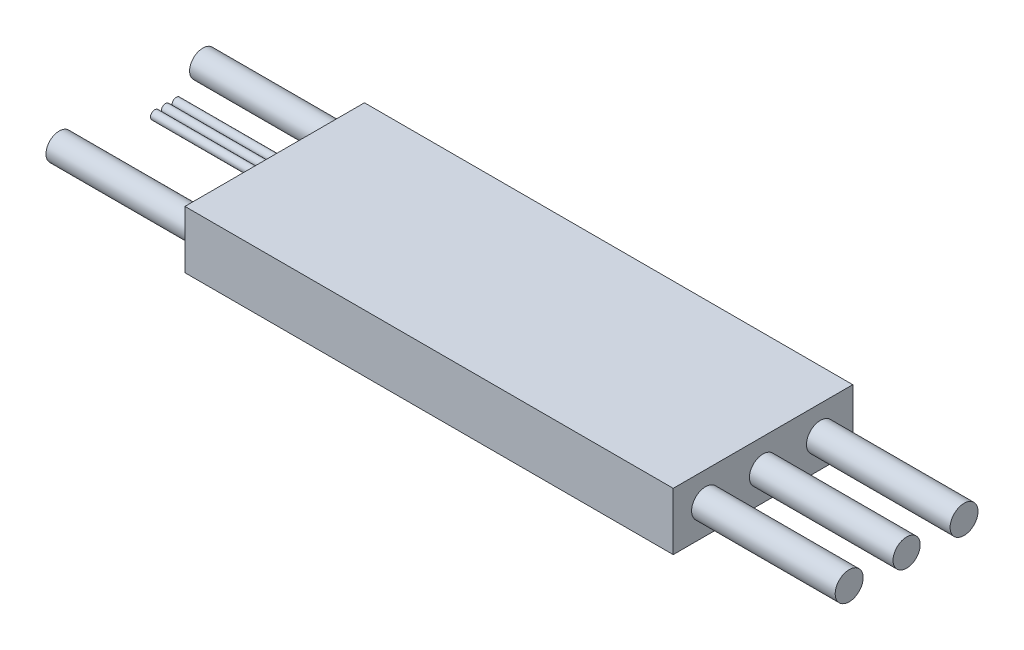
ISO-10303-21;
HEADER;
FILE_DESCRIPTION(('STEP AP214'),'2;1');
FILE_NAME('part.step','',(''),(''),'','','');
FILE_SCHEMA(('AUTOMOTIVE_DESIGN { 1 0 10303 214 1 1 1 1 }'));
ENDSEC;
DATA;
#1=APPLICATION_CONTEXT('core data for automotive mechanical design processes');
#2=APPLICATION_PROTOCOL_DEFINITION('international standard','automotive_design',2000,#1);
#3=PRODUCT_CONTEXT('',#1,'mechanical');
#4=PRODUCT('Part','Part','',(#3));
#5=PRODUCT_RELATED_PRODUCT_CATEGORY('part','',(#4));
#6=PRODUCT_DEFINITION_FORMATION('','',#4);
#7=PRODUCT_DEFINITION_CONTEXT('part definition',#1,'design');
#8=PRODUCT_DEFINITION('design','',#6,#7);
#9=PRODUCT_DEFINITION_SHAPE('','',#8);
#10=(LENGTH_UNIT() NAMED_UNIT(*) SI_UNIT(.MILLI.,.METRE.));
#11=(NAMED_UNIT(*) PLANE_ANGLE_UNIT() SI_UNIT($,.RADIAN.));
#12=(NAMED_UNIT(*) SI_UNIT($,.STERADIAN.) SOLID_ANGLE_UNIT());
#13=UNCERTAINTY_MEASURE_WITH_UNIT(LENGTH_MEASURE(1.E-05),#10,'distance_accuracy_value','');
#14=(GEOMETRIC_REPRESENTATION_CONTEXT(3) GLOBAL_UNCERTAINTY_ASSIGNED_CONTEXT((#13)) GLOBAL_UNIT_ASSIGNED_CONTEXT((#10,
#11,#12)) REPRESENTATION_CONTEXT('',''));
#15=CARTESIAN_POINT('',(0.,0.,0.));
#16=DIRECTION('',(0.,0.,1.));
#17=DIRECTION('',(1.,0.,0.));
#18=AXIS2_PLACEMENT_3D('',#15,#16,#17);
#19=CARTESIAN_POINT('',(-34.,8.,-12.5));
#20=DIRECTION('',(1.,0.,0.));
#21=DIRECTION('',(0.,0.,-1.));
#22=AXIS2_PLACEMENT_3D('',#19,#20,#21);
#23=PLANE('',#22);
#24=CARTESIAN_POINT('',(-34.,1.16252330107337,-3.30252833955041));
#25=DIRECTION('',(1.,0.,0.));
#26=DIRECTION('',(0.,0.,-1.));
#27=AXIS2_PLACEMENT_3D('',#24,#25,#26);
#28=CIRCLE('',#27,0.6);
#29=CARTESIAN_POINT('',(-34.,1.16252330107337,-3.90252833955041));
#30=VERTEX_POINT('',#29);
#31=EDGE_CURVE('E123',#30,#30,#28,.F.);
#32=ORIENTED_EDGE('',*,*,#31,.F.);
#33=EDGE_LOOP('',(#32));
#34=FACE_BOUND('',#33,.T.);
#35=CARTESIAN_POINT('',(-34.,1.16252330107337,-4.80252833955041));
#36=DIRECTION('',(1.,0.,0.));
#37=DIRECTION('',(0.,0.,-1.));
#38=AXIS2_PLACEMENT_3D('',#35,#36,#37);
#39=CIRCLE('',#38,0.6);
#40=CARTESIAN_POINT('',(-34.,1.16252330107337,-5.40252833955041));
#41=VERTEX_POINT('',#40);
#42=EDGE_CURVE('E120',#41,#41,#39,.F.);
#43=ORIENTED_EDGE('',*,*,#42,.F.);
#44=EDGE_LOOP('',(#43));
#45=FACE_BOUND('',#44,.T.);
#46=CARTESIAN_POINT('',(-34.,1.16252330107337,-6.30252833955041));
#47=DIRECTION('',(1.,0.,0.));
#48=DIRECTION('',(0.,0.,-1.));
#49=AXIS2_PLACEMENT_3D('',#46,#47,#48);
#50=CIRCLE('',#49,0.6);
#51=CARTESIAN_POINT('',(-34.,1.16252330107337,-6.90252833955041));
#52=VERTEX_POINT('',#51);
#53=EDGE_CURVE('E117',#52,#52,#50,.F.);
#54=ORIENTED_EDGE('',*,*,#53,.F.);
#55=EDGE_LOOP('',(#54));
#56=FACE_BOUND('',#55,.T.);
#57=CARTESIAN_POINT('',(-34.,4.,10.));
#58=DIRECTION('',(1.,0.,0.));
#59=DIRECTION('',(0.,0.,-1.));
#60=AXIS2_PLACEMENT_3D('',#57,#58,#59);
#61=CIRCLE('',#60,1.85);
#62=CARTESIAN_POINT('',(-34.,4.,8.15));
#63=VERTEX_POINT('',#62);
#64=EDGE_CURVE('E114',#63,#63,#61,.F.);
#65=ORIENTED_EDGE('',*,*,#64,.F.);
#66=EDGE_LOOP('',(#65));
#67=FACE_BOUND('',#66,.T.);
#68=CARTESIAN_POINT('',(-34.,4.,-10.));
#69=DIRECTION('',(1.,0.,0.));
#70=DIRECTION('',(0.,0.,-1.));
#71=AXIS2_PLACEMENT_3D('',#68,#69,#70);
#72=CIRCLE('',#71,1.85);
#73=CARTESIAN_POINT('',(-34.,4.,-11.85));
#74=VERTEX_POINT('',#73);
#75=EDGE_CURVE('E111',#74,#74,#72,.F.);
#76=ORIENTED_EDGE('',*,*,#75,.F.);
#77=EDGE_LOOP('',(#76));
#78=FACE_BOUND('',#77,.T.);
#79=DIRECTION('',(0.,0.,1.));
#80=VECTOR('',#79,1.);
#81=CARTESIAN_POINT('',(-34.,0.,-12.5));
#82=LINE('',#81,#80);
#83=CARTESIAN_POINT('',(-34.,0.,-12.5));
#84=VERTEX_POINT('',#83);
#85=CARTESIAN_POINT('',(-34.,0.,12.5));
#86=VERTEX_POINT('',#85);
#87=EDGE_CURVE('E101',#84,#86,#82,.T.);
#88=ORIENTED_EDGE('',*,*,#87,.T.);
#89=DIRECTION('',(0.,-1.,0.));
#90=VECTOR('',#89,1.);
#91=CARTESIAN_POINT('',(-34.,8.,12.5));
#92=LINE('',#91,#90);
#93=CARTESIAN_POINT('',(-34.,8.,12.5));
#94=VERTEX_POINT('',#93);
#95=EDGE_CURVE('E92',#94,#86,#92,.T.);
#96=ORIENTED_EDGE('',*,*,#95,.F.);
#97=DIRECTION('',(0.,0.,1.));
#98=VECTOR('',#97,1.);
#99=CARTESIAN_POINT('',(-34.,8.,-12.5));
#100=LINE('',#99,#98);
#101=CARTESIAN_POINT('',(-34.,8.,-12.5));
#102=VERTEX_POINT('',#101);
#103=EDGE_CURVE('E86',#102,#94,#100,.T.);
#104=ORIENTED_EDGE('',*,*,#103,.F.);
#105=DIRECTION('',(0.,-1.,0.));
#106=VECTOR('',#105,1.);
#107=CARTESIAN_POINT('',(-34.,8.,-12.5));
#108=LINE('',#107,#106);
#109=EDGE_CURVE('E97',#102,#84,#108,.T.);
#110=ORIENTED_EDGE('',*,*,#109,.T.);
#111=EDGE_LOOP('',(#88,#96,#104,#110));
#112=FACE_BOUND('',#111,.T.);
#113=ADVANCED_FACE('F34',(#34,#45,#56,#67,#78,#112),#23,.F.);
#114=CARTESIAN_POINT('',(-34.,8.,12.5));
#115=DIRECTION('',(0.,0.,-1.));
#116=DIRECTION('',(-1.,0.,0.));
#117=AXIS2_PLACEMENT_3D('',#114,#115,#116);
#118=PLANE('',#117);
#119=DIRECTION('',(1.,0.,0.));
#120=VECTOR('',#119,1.);
#121=CARTESIAN_POINT('',(-34.,0.,12.5));
#122=LINE('',#121,#120);
#123=CARTESIAN_POINT('',(34.,0.,12.5));
#124=VERTEX_POINT('',#123);
#125=EDGE_CURVE('E91',#86,#124,#122,.T.);
#126=ORIENTED_EDGE('',*,*,#125,.T.);
#127=DIRECTION('',(0.,-1.,0.));
#128=VECTOR('',#127,1.);
#129=CARTESIAN_POINT('',(34.,8.,12.5));
#130=LINE('',#129,#128);
#131=CARTESIAN_POINT('',(34.,8.,12.5));
#132=VERTEX_POINT('',#131);
#133=EDGE_CURVE('E89',#132,#124,#130,.T.);
#134=ORIENTED_EDGE('',*,*,#133,.F.);
#135=DIRECTION('',(1.,0.,0.));
#136=VECTOR('',#135,1.);
#137=CARTESIAN_POINT('',(-34.,8.,12.5));
#138=LINE('',#137,#136);
#139=EDGE_CURVE('E81',#94,#132,#138,.T.);
#140=ORIENTED_EDGE('',*,*,#139,.F.);
#141=ORIENTED_EDGE('',*,*,#95,.T.);
#142=EDGE_LOOP('',(#126,#134,#140,#141));
#143=FACE_BOUND('',#142,.T.);
#144=ADVANCED_FACE('F90',(#143),#118,.F.);
#145=CARTESIAN_POINT('',(34.,8.,-12.5));
#146=DIRECTION('',(-1.,0.,0.));
#147=DIRECTION('',(0.,0.,1.));
#148=AXIS2_PLACEMENT_3D('',#145,#146,#147);
#149=PLANE('',#148);
#150=CARTESIAN_POINT('',(34.,4.,-8.));
#151=DIRECTION('',(-1.,0.,0.));
#152=DIRECTION('',(0.,0.,1.));
#153=AXIS2_PLACEMENT_3D('',#150,#151,#152);
#154=CIRCLE('',#153,1.94570262627597);
#155=CARTESIAN_POINT('',(34.,4.,-6.05429737372403));
#156=VERTEX_POINT('',#155);
#157=EDGE_CURVE('E11',#156,#156,#154,.F.);
#158=ORIENTED_EDGE('',*,*,#157,.F.);
#159=EDGE_LOOP('',(#158));
#160=FACE_BOUND('',#159,.T.);
#161=CARTESIAN_POINT('',(34.,4.,0.));
#162=DIRECTION('',(-1.,0.,0.));
#163=DIRECTION('',(0.,0.,1.));
#164=AXIS2_PLACEMENT_3D('',#161,#162,#163);
#165=CIRCLE('',#164,1.89143712586387);
#166=CARTESIAN_POINT('',(34.,4.,1.89143712586387));
#167=VERTEX_POINT('',#166);
#168=EDGE_CURVE('E42',#167,#167,#165,.F.);
#169=ORIENTED_EDGE('',*,*,#168,.F.);
#170=EDGE_LOOP('',(#169));
#171=FACE_BOUND('',#170,.T.);
#172=CARTESIAN_POINT('',(34.,4.,8.));
#173=DIRECTION('',(-1.,0.,0.));
#174=DIRECTION('',(0.,0.,1.));
#175=AXIS2_PLACEMENT_3D('',#172,#173,#174);
#176=CIRCLE('',#175,1.94570262627597);
#177=CARTESIAN_POINT('',(34.,4.,9.94570262627597));
#178=VERTEX_POINT('',#177);
#179=EDGE_CURVE('E126',#178,#178,#176,.F.);
#180=ORIENTED_EDGE('',*,*,#179,.F.);
#181=EDGE_LOOP('',(#180));
#182=FACE_BOUND('',#181,.T.);
#183=DIRECTION('',(0.,0.,-1.));
#184=VECTOR('',#183,1.);
#185=CARTESIAN_POINT('',(34.,0.,-12.5));
#186=LINE('',#185,#184);
#187=CARTESIAN_POINT('',(34.,0.,-12.5));
#188=VERTEX_POINT('',#187);
#189=EDGE_CURVE('E67',#124,#188,#186,.T.);
#190=ORIENTED_EDGE('',*,*,#189,.T.);
#191=DIRECTION('',(0.,-1.,0.));
#192=VECTOR('',#191,1.);
#193=CARTESIAN_POINT('',(34.,8.,-12.5));
#194=LINE('',#193,#192);
#195=CARTESIAN_POINT('',(34.,8.,-12.5));
#196=VERTEX_POINT('',#195);
#197=EDGE_CURVE('E93',#196,#188,#194,.T.);
#198=ORIENTED_EDGE('',*,*,#197,.F.);
#199=DIRECTION('',(0.,0.,-1.));
#200=VECTOR('',#199,1.);
#201=CARTESIAN_POINT('',(34.,8.,-12.5));
#202=LINE('',#201,#200);
#203=EDGE_CURVE('E84',#132,#196,#202,.T.);
#204=ORIENTED_EDGE('',*,*,#203,.F.);
#205=ORIENTED_EDGE('',*,*,#133,.T.);
#206=EDGE_LOOP('',(#190,#198,#204,#205));
#207=FACE_BOUND('',#206,.T.);
#208=ADVANCED_FACE('F95',(#160,#171,#182,#207),#149,.F.);
#209=CARTESIAN_POINT('',(-34.,8.,-12.5));
#210=DIRECTION('',(0.,0.,1.));
#211=DIRECTION('',(1.,0.,0.));
#212=AXIS2_PLACEMENT_3D('',#209,#210,#211);
#213=PLANE('',#212);
#214=DIRECTION('',(-1.,0.,0.));
#215=VECTOR('',#214,1.);
#216=CARTESIAN_POINT('',(-34.,0.,-12.5));
#217=LINE('',#216,#215);
#218=EDGE_CURVE('E73',#188,#84,#217,.T.);
#219=ORIENTED_EDGE('',*,*,#218,.T.);
#220=ORIENTED_EDGE('',*,*,#109,.F.);
#221=DIRECTION('',(-1.,0.,0.));
#222=VECTOR('',#221,1.);
#223=CARTESIAN_POINT('',(-34.,8.,-12.5));
#224=LINE('',#223,#222);
#225=EDGE_CURVE('E50',#196,#102,#224,.T.);
#226=ORIENTED_EDGE('',*,*,#225,.F.);
#227=ORIENTED_EDGE('',*,*,#197,.T.);
#228=EDGE_LOOP('',(#219,#220,#226,#227));
#229=FACE_BOUND('',#228,.T.);
#230=ADVANCED_FACE('F135',(#229),#213,.F.);
#231=CARTESIAN_POINT('',(0.,8.,0.));
#232=DIRECTION('',(0.,1.,0.));
#233=DIRECTION('',(0.,0.,1.));
#234=AXIS2_PLACEMENT_3D('',#231,#232,#233);
#235=PLANE('',#234);
#236=ORIENTED_EDGE('',*,*,#103,.T.);
#237=ORIENTED_EDGE('',*,*,#139,.T.);
#238=ORIENTED_EDGE('',*,*,#203,.T.);
#239=ORIENTED_EDGE('',*,*,#225,.T.);
#240=EDGE_LOOP('',(#236,#237,#238,#239));
#241=FACE_BOUND('',#240,.T.);
#242=ADVANCED_FACE('F82',(#241),#235,.T.);
#243=CARTESIAN_POINT('',(0.,0.,0.));
#244=DIRECTION('',(0.,1.,0.));
#245=DIRECTION('',(0.,0.,1.));
#246=AXIS2_PLACEMENT_3D('',#243,#244,#245);
#247=PLANE('',#246);
#248=ORIENTED_EDGE('',*,*,#87,.F.);
#249=ORIENTED_EDGE('',*,*,#218,.F.);
#250=ORIENTED_EDGE('',*,*,#189,.F.);
#251=ORIENTED_EDGE('',*,*,#125,.F.);
#252=EDGE_LOOP('',(#248,#249,#250,#251));
#253=FACE_BOUND('',#252,.T.);
#254=ADVANCED_FACE('F173',(#253),#247,.F.);
#255=CARTESIAN_POINT('',(-54.,4.,-10.));
#256=DIRECTION('',(1.,0.,0.));
#257=DIRECTION('',(0.,0.,-1.));
#258=AXIS2_PLACEMENT_3D('',#255,#256,#257);
#259=CYLINDRICAL_SURFACE('',#258,1.85);
#260=CARTESIAN_POINT('',(-54.,4.,-10.));
#261=DIRECTION('',(-1.,0.,0.));
#262=DIRECTION('',(0.,0.,1.));
#263=AXIS2_PLACEMENT_3D('',#260,#261,#262);
#264=CIRCLE('',#263,1.85);
#265=CARTESIAN_POINT('',(-54.,4.,-8.15));
#266=VERTEX_POINT('',#265);
#267=EDGE_CURVE('E104',#266,#266,#264,.T.);
#268=ORIENTED_EDGE('',*,*,#267,.F.);
#269=EDGE_LOOP('',(#268));
#270=FACE_BOUND('',#269,.T.);
#271=ORIENTED_EDGE('',*,*,#75,.T.);
#272=EDGE_LOOP('',(#271));
#273=FACE_BOUND('',#272,.T.);
#274=ADVANCED_FACE('F175',(#270,#273),#259,.T.);
#275=CARTESIAN_POINT('',(-54.,4.,-10.));
#276=DIRECTION('',(-1.,0.,0.));
#277=DIRECTION('',(0.,0.,1.));
#278=AXIS2_PLACEMENT_3D('',#275,#276,#277);
#279=PLANE('',#278);
#280=ORIENTED_EDGE('',*,*,#267,.T.);
#281=EDGE_LOOP('',(#280));
#282=FACE_BOUND('',#281,.T.);
#283=ADVANCED_FACE('F181',(#282),#279,.T.);
#284=CARTESIAN_POINT('',(-54.,4.,10.));
#285=DIRECTION('',(1.,0.,0.));
#286=DIRECTION('',(0.,0.,-1.));
#287=AXIS2_PLACEMENT_3D('',#284,#285,#286);
#288=CYLINDRICAL_SURFACE('',#287,1.85);
#289=CARTESIAN_POINT('',(-54.,4.,10.));
#290=DIRECTION('',(-1.,0.,0.));
#291=DIRECTION('',(0.,0.,-1.));
#292=AXIS2_PLACEMENT_3D('',#289,#290,#291);
#293=CIRCLE('',#292,1.85);
#294=CARTESIAN_POINT('',(-54.,4.,8.15));
#295=VERTEX_POINT('',#294);
#296=EDGE_CURVE('E394',#295,#295,#293,.T.);
#297=ORIENTED_EDGE('',*,*,#296,.F.);
#298=EDGE_LOOP('',(#297));
#299=FACE_BOUND('',#298,.T.);
#300=ORIENTED_EDGE('',*,*,#64,.T.);
#301=EDGE_LOOP('',(#300));
#302=FACE_BOUND('',#301,.T.);
#303=ADVANCED_FACE('F223',(#299,#302),#288,.T.);
#304=CARTESIAN_POINT('',(-54.,4.,10.));
#305=DIRECTION('',(1.,0.,0.));
#306=DIRECTION('',(0.,0.,-1.));
#307=AXIS2_PLACEMENT_3D('',#304,#305,#306);
#308=PLANE('',#307);
#309=ORIENTED_EDGE('',*,*,#296,.T.);
#310=EDGE_LOOP('',(#309));
#311=FACE_BOUND('',#310,.T.);
#312=ADVANCED_FACE('F235',(#311),#308,.F.);
#313=CARTESIAN_POINT('',(-54.,1.16252330107337,-6.30252833955041));
#314=DIRECTION('',(1.,0.,0.));
#315=DIRECTION('',(0.,0.,-1.));
#316=AXIS2_PLACEMENT_3D('',#313,#314,#315);
#317=CYLINDRICAL_SURFACE('',#316,0.6);
#318=CARTESIAN_POINT('',(-54.,1.16252330107337,-6.30252833955041));
#319=DIRECTION('',(-1.,0.,0.));
#320=DIRECTION('',(0.,0.,1.));
#321=AXIS2_PLACEMENT_3D('',#318,#319,#320);
#322=CIRCLE('',#321,0.6);
#323=CARTESIAN_POINT('',(-54.,1.16252330107337,-5.70252833955041));
#324=VERTEX_POINT('',#323);
#325=EDGE_CURVE('E391',#324,#324,#322,.T.);
#326=ORIENTED_EDGE('',*,*,#325,.F.);
#327=EDGE_LOOP('',(#326));
#328=FACE_BOUND('',#327,.T.);
#329=ORIENTED_EDGE('',*,*,#53,.T.);
#330=EDGE_LOOP('',(#329));
#331=FACE_BOUND('',#330,.T.);
#332=ADVANCED_FACE('F246',(#328,#331),#317,.T.);
#333=CARTESIAN_POINT('',(-54.,1.16252330107337,-6.30252833955041));
#334=DIRECTION('',(-1.,0.,0.));
#335=DIRECTION('',(0.,0.,1.));
#336=AXIS2_PLACEMENT_3D('',#333,#334,#335);
#337=PLANE('',#336);
#338=ORIENTED_EDGE('',*,*,#325,.T.);
#339=EDGE_LOOP('',(#338));
#340=FACE_BOUND('',#339,.T.);
#341=ADVANCED_FACE('F257',(#340),#337,.T.);
#342=CARTESIAN_POINT('',(-54.,1.16252330107337,-4.80252833955041));
#343=DIRECTION('',(1.,0.,0.));
#344=DIRECTION('',(0.,0.,-1.));
#345=AXIS2_PLACEMENT_3D('',#342,#343,#344);
#346=CYLINDRICAL_SURFACE('',#345,0.6);
#347=CARTESIAN_POINT('',(-54.,1.16252330107337,-4.80252833955041));
#348=DIRECTION('',(-1.,0.,0.));
#349=DIRECTION('',(0.,0.,1.));
#350=AXIS2_PLACEMENT_3D('',#347,#348,#349);
#351=CIRCLE('',#350,0.6);
#352=CARTESIAN_POINT('',(-54.,1.16252330107337,-4.20252833955041));
#353=VERTEX_POINT('',#352);
#354=EDGE_CURVE('E388',#353,#353,#351,.T.);
#355=ORIENTED_EDGE('',*,*,#354,.F.);
#356=EDGE_LOOP('',(#355));
#357=FACE_BOUND('',#356,.T.);
#358=ORIENTED_EDGE('',*,*,#42,.T.);
#359=EDGE_LOOP('',(#358));
#360=FACE_BOUND('',#359,.T.);
#361=ADVANCED_FACE('F269',(#357,#360),#346,.T.);
#362=CARTESIAN_POINT('',(-54.,1.16252330107337,-4.80252833955041));
#363=DIRECTION('',(-1.,0.,0.));
#364=DIRECTION('',(0.,0.,1.));
#365=AXIS2_PLACEMENT_3D('',#362,#363,#364);
#366=PLANE('',#365);
#367=ORIENTED_EDGE('',*,*,#354,.T.);
#368=EDGE_LOOP('',(#367));
#369=FACE_BOUND('',#368,.T.);
#370=ADVANCED_FACE('F280',(#369),#366,.T.);
#371=CARTESIAN_POINT('',(-54.,1.16252330107337,-3.30252833955041));
#372=DIRECTION('',(1.,0.,0.));
#373=DIRECTION('',(0.,0.,-1.));
#374=AXIS2_PLACEMENT_3D('',#371,#372,#373);
#375=CYLINDRICAL_SURFACE('',#374,0.6);
#376=CARTESIAN_POINT('',(-54.,1.16252330107337,-3.30252833955041));
#377=DIRECTION('',(-1.,0.,0.));
#378=DIRECTION('',(0.,0.,1.));
#379=AXIS2_PLACEMENT_3D('',#376,#377,#378);
#380=CIRCLE('',#379,0.6);
#381=CARTESIAN_POINT('',(-54.,1.16252330107337,-2.70252833955041));
#382=VERTEX_POINT('',#381);
#383=EDGE_CURVE('E385',#382,#382,#380,.T.);
#384=ORIENTED_EDGE('',*,*,#383,.F.);
#385=EDGE_LOOP('',(#384));
#386=FACE_BOUND('',#385,.T.);
#387=ORIENTED_EDGE('',*,*,#31,.T.);
#388=EDGE_LOOP('',(#387));
#389=FACE_BOUND('',#388,.T.);
#390=ADVANCED_FACE('F152',(#386,#389),#375,.T.);
#391=CARTESIAN_POINT('',(-54.,1.16252330107337,-3.30252833955041));
#392=DIRECTION('',(-1.,0.,0.));
#393=DIRECTION('',(0.,0.,1.));
#394=AXIS2_PLACEMENT_3D('',#391,#392,#393);
#395=PLANE('',#394);
#396=ORIENTED_EDGE('',*,*,#383,.T.);
#397=EDGE_LOOP('',(#396));
#398=FACE_BOUND('',#397,.T.);
#399=ADVANCED_FACE('F143',(#398),#395,.T.);
#400=CARTESIAN_POINT('',(54.,4.,8.));
#401=DIRECTION('',(-1.,0.,0.));
#402=DIRECTION('',(0.,0.,1.));
#403=AXIS2_PLACEMENT_3D('',#400,#401,#402);
#404=CYLINDRICAL_SURFACE('',#403,1.94570262627597);
#405=CARTESIAN_POINT('',(54.,4.,8.));
#406=DIRECTION('',(1.,0.,0.));
#407=DIRECTION('',(0.,0.,-1.));
#408=AXIS2_PLACEMENT_3D('',#405,#406,#407);
#409=CIRCLE('',#408,1.94570262627597);
#410=CARTESIAN_POINT('',(54.,4.,6.05429737372403));
#411=VERTEX_POINT('',#410);
#412=EDGE_CURVE('E380',#411,#411,#409,.T.);
#413=ORIENTED_EDGE('',*,*,#412,.F.);
#414=EDGE_LOOP('',(#413));
#415=FACE_BOUND('',#414,.T.);
#416=ORIENTED_EDGE('',*,*,#179,.T.);
#417=EDGE_LOOP('',(#416));
#418=FACE_BOUND('',#417,.T.);
#419=ADVANCED_FACE('F140',(#415,#418),#404,.T.);
#420=CARTESIAN_POINT('',(54.,4.,8.));
#421=DIRECTION('',(1.,0.,0.));
#422=DIRECTION('',(0.,0.,-1.));
#423=AXIS2_PLACEMENT_3D('',#420,#421,#422);
#424=PLANE('',#423);
#425=ORIENTED_EDGE('',*,*,#412,.T.);
#426=EDGE_LOOP('',(#425));
#427=FACE_BOUND('',#426,.T.);
#428=ADVANCED_FACE('F142',(#427),#424,.T.);
#429=CARTESIAN_POINT('',(54.,4.,0.));
#430=DIRECTION('',(-1.,0.,0.));
#431=DIRECTION('',(0.,0.,1.));
#432=AXIS2_PLACEMENT_3D('',#429,#430,#431);
#433=CYLINDRICAL_SURFACE('',#432,1.89143712586387);
#434=CARTESIAN_POINT('',(54.,4.,0.));
#435=DIRECTION('',(1.,0.,0.));
#436=DIRECTION('',(0.,0.,-1.));
#437=AXIS2_PLACEMENT_3D('',#434,#435,#436);
#438=CIRCLE('',#437,1.89143712586387);
#439=CARTESIAN_POINT('',(54.,4.,-1.89143712586387));
#440=VERTEX_POINT('',#439);
#441=EDGE_CURVE('E377',#440,#440,#438,.T.);
#442=ORIENTED_EDGE('',*,*,#441,.F.);
#443=EDGE_LOOP('',(#442));
#444=FACE_BOUND('',#443,.T.);
#445=ORIENTED_EDGE('',*,*,#168,.T.);
#446=EDGE_LOOP('',(#445));
#447=FACE_BOUND('',#446,.T.);
#448=ADVANCED_FACE('F131',(#444,#447),#433,.T.);
#449=CARTESIAN_POINT('',(54.,4.,0.));
#450=DIRECTION('',(1.,0.,0.));
#451=DIRECTION('',(0.,0.,-1.));
#452=AXIS2_PLACEMENT_3D('',#449,#450,#451);
#453=PLANE('',#452);
#454=ORIENTED_EDGE('',*,*,#441,.T.);
#455=EDGE_LOOP('',(#454));
#456=FACE_BOUND('',#455,.T.);
#457=ADVANCED_FACE('F335',(#456),#453,.T.);
#458=CARTESIAN_POINT('',(54.,4.,-8.));
#459=DIRECTION('',(-1.,0.,0.));
#460=DIRECTION('',(0.,0.,1.));
#461=AXIS2_PLACEMENT_3D('',#458,#459,#460);
#462=CYLINDRICAL_SURFACE('',#461,1.94570262627597);
#463=CARTESIAN_POINT('',(54.,4.,-8.));
#464=DIRECTION('',(1.,0.,0.));
#465=DIRECTION('',(0.,0.,1.));
#466=AXIS2_PLACEMENT_3D('',#463,#464,#465);
#467=CIRCLE('',#466,1.94570262627597);
#468=CARTESIAN_POINT('',(54.,4.,-6.05429737372403));
#469=VERTEX_POINT('',#468);
#470=EDGE_CURVE('E376',#469,#469,#467,.T.);
#471=ORIENTED_EDGE('',*,*,#470,.F.);
#472=EDGE_LOOP('',(#471));
#473=FACE_BOUND('',#472,.T.);
#474=ORIENTED_EDGE('',*,*,#157,.T.);
#475=EDGE_LOOP('',(#474));
#476=FACE_BOUND('',#475,.T.);
#477=ADVANCED_FACE('F345',(#473,#476),#462,.T.);
#478=CARTESIAN_POINT('',(54.,4.,-8.));
#479=DIRECTION('',(-1.,0.,0.));
#480=DIRECTION('',(0.,0.,1.));
#481=AXIS2_PLACEMENT_3D('',#478,#479,#480);
#482=PLANE('',#481);
#483=ORIENTED_EDGE('',*,*,#470,.T.);
#484=EDGE_LOOP('',(#483));
#485=FACE_BOUND('',#484,.T.);
#486=ADVANCED_FACE('F355',(#485),#482,.F.);
#487=CLOSED_SHELL('',(#113,#144,#208,#230,#242,#254,#274,#283,#303,#312,#332,#341,#361,#370,
#390,#399,#419,#428,#448,#457,#477,#486));
#488=MANIFOLD_SOLID_BREP('B2',#487);
#489=ADVANCED_BREP_SHAPE_REPRESENTATION('',(#18,#488),#14);
#490=SHAPE_DEFINITION_REPRESENTATION(#9,#489);
ENDSEC;
END-ISO-10303-21;
